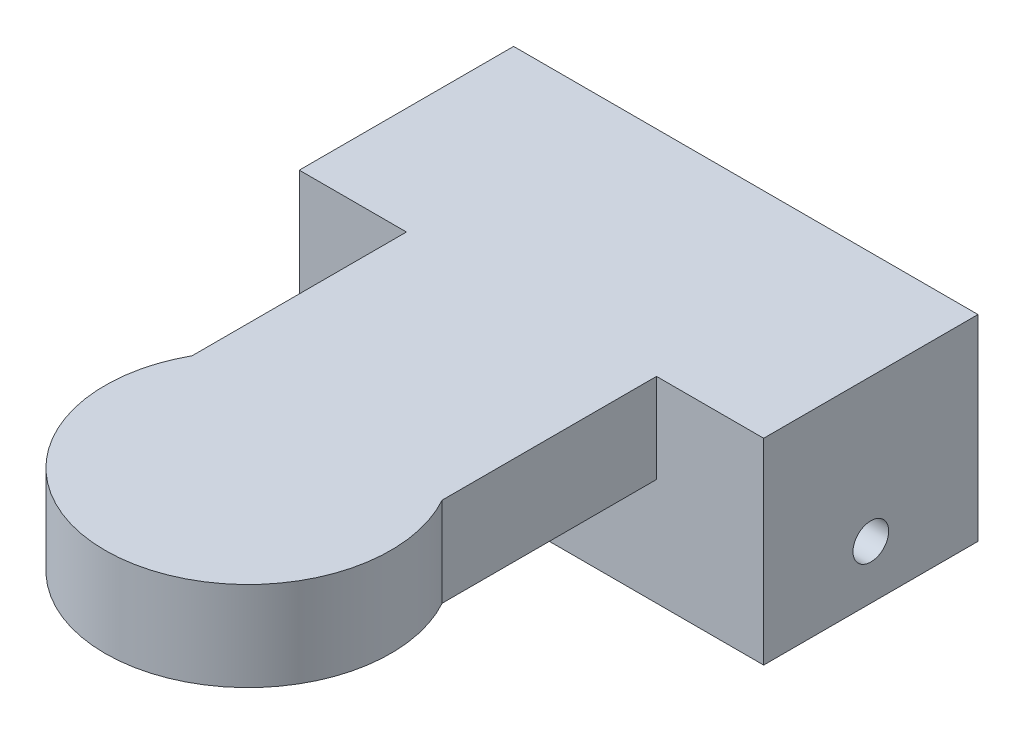
ISO-10303-21;
HEADER;
FILE_DESCRIPTION(('STEP AP214'),'2;1');
FILE_NAME('part.step','',(''),(''),'','','');
FILE_SCHEMA(('AUTOMOTIVE_DESIGN { 1 0 10303 214 1 1 1 1 }'));
ENDSEC;
DATA;
#1=APPLICATION_CONTEXT('core data for automotive mechanical design processes');
#2=APPLICATION_PROTOCOL_DEFINITION('international standard','automotive_design',2000,#1);
#3=PRODUCT_CONTEXT('',#1,'mechanical');
#4=PRODUCT('Part','Part','',(#3));
#5=PRODUCT_RELATED_PRODUCT_CATEGORY('part','',(#4));
#6=PRODUCT_DEFINITION_FORMATION('','',#4);
#7=PRODUCT_DEFINITION_CONTEXT('part definition',#1,'design');
#8=PRODUCT_DEFINITION('design','',#6,#7);
#9=PRODUCT_DEFINITION_SHAPE('','',#8);
#10=(LENGTH_UNIT() NAMED_UNIT(*) SI_UNIT(.MILLI.,.METRE.));
#11=(NAMED_UNIT(*) PLANE_ANGLE_UNIT() SI_UNIT($,.RADIAN.));
#12=(NAMED_UNIT(*) SI_UNIT($,.STERADIAN.) SOLID_ANGLE_UNIT());
#13=UNCERTAINTY_MEASURE_WITH_UNIT(LENGTH_MEASURE(1.E-05),#10,'distance_accuracy_value','');
#14=(GEOMETRIC_REPRESENTATION_CONTEXT(3) GLOBAL_UNCERTAINTY_ASSIGNED_CONTEXT((#13)) GLOBAL_UNIT_ASSIGNED_CONTEXT((#10,
#11,#12)) REPRESENTATION_CONTEXT('',''));
#15=CARTESIAN_POINT('',(0.,0.,0.));
#16=DIRECTION('',(0.,0.,1.));
#17=DIRECTION('',(1.,0.,0.));
#18=AXIS2_PLACEMENT_3D('',#15,#16,#17);
#19=CARTESIAN_POINT('',(0.,0.,0.));
#20=DIRECTION('',(0.,1.,0.));
#21=DIRECTION('',(0.,0.,1.));
#22=AXIS2_PLACEMENT_3D('',#19,#20,#21);
#23=PLANE('',#22);
#24=DIRECTION('',(-1.,0.,0.));
#25=VECTOR('',#24,1.);
#26=CARTESIAN_POINT('',(-22.5,0.,-49.6324583655186));
#27=LINE('',#26,#25);
#28=CARTESIAN_POINT('',(22.5,0.,-49.6324583655186));
#29=VERTEX_POINT('',#28);
#30=CARTESIAN_POINT('',(-22.5,0.,-49.6324583655186));
#31=VERTEX_POINT('',#30);
#32=EDGE_CURVE('E337',#29,#31,#27,.T.);
#33=ORIENTED_EDGE('',*,*,#32,.T.);
#34=DIRECTION('',(0.,0.,1.));
#35=VECTOR('',#34,1.);
#36=CARTESIAN_POINT('',(-22.5,0.,-69.6824583655185));
#37=LINE('',#36,#35);
#38=CARTESIAN_POINT('',(-22.5,0.,-59.7324583655185));
#39=VERTEX_POINT('',#38);
#40=EDGE_CURVE('E203',#39,#31,#37,.T.);
#41=ORIENTED_EDGE('',*,*,#40,.F.);
#42=DIRECTION('',(1.,0.,0.));
#43=VECTOR('',#42,1.);
#44=CARTESIAN_POINT('',(22.5,0.,-59.7324583655185));
#45=LINE('',#44,#43);
#46=CARTESIAN_POINT('',(22.5,0.,-59.7324583655185));
#47=VERTEX_POINT('',#46);
#48=EDGE_CURVE('E325',#39,#47,#45,.T.);
#49=ORIENTED_EDGE('',*,*,#48,.T.);
#50=DIRECTION('',(0.,0.,1.));
#51=VECTOR('',#50,1.);
#52=CARTESIAN_POINT('',(22.5,0.,-69.6824583655185));
#53=LINE('',#52,#51);
#54=EDGE_CURVE('E204',#47,#29,#53,.T.);
#55=ORIENTED_EDGE('',*,*,#54,.T.);
#56=EDGE_LOOP('',(#33,#41,#49,#55));
#57=FACE_BOUND('',#56,.T.);
#58=ADVANCED_FACE('F44',(#57),#23,.F.);
#59=CARTESIAN_POINT('',(22.5,-15.,-69.6824583655185));
#60=DIRECTION('',(1.,0.,0.));
#61=DIRECTION('',(0.,0.,-1.));
#62=AXIS2_PLACEMENT_3D('',#59,#60,#61);
#63=PLANE('',#62);
#64=CARTESIAN_POINT('',(22.5,-7.5,-54.6824583655185));
#65=DIRECTION('',(1.,0.,0.));
#66=DIRECTION('',(0.,0.,-1.));
#67=AXIS2_PLACEMENT_3D('',#64,#65,#66);
#68=CIRCLE('',#67,2.5);
#69=CARTESIAN_POINT('',(22.5,-7.5,-57.1824583655185));
#70=VERTEX_POINT('',#69);
#71=EDGE_CURVE('E286',#70,#70,#68,.T.);
#72=ORIENTED_EDGE('',*,*,#71,.T.);
#73=EDGE_LOOP('',(#72));
#74=FACE_BOUND('',#73,.T.);
#75=DIRECTION('',(0.,1.,0.));
#76=VECTOR('',#75,1.);
#77=CARTESIAN_POINT('',(22.5,0.,-49.6324583655186));
#78=LINE('',#77,#76);
#79=CARTESIAN_POINT('',(22.5,-15.,-49.6324583655186));
#80=VERTEX_POINT('',#79);
#81=EDGE_CURVE('E70',#80,#29,#78,.T.);
#82=ORIENTED_EDGE('',*,*,#81,.T.);
#83=ORIENTED_EDGE('',*,*,#54,.F.);
#84=DIRECTION('',(0.,-1.,0.));
#85=VECTOR('',#84,1.);
#86=CARTESIAN_POINT('',(22.5,0.,-59.7324583655185));
#87=LINE('',#86,#85);
#88=CARTESIAN_POINT('',(22.5,-15.,-59.7324583655185));
#89=VERTEX_POINT('',#88);
#90=EDGE_CURVE('E331',#47,#89,#87,.T.);
#91=ORIENTED_EDGE('',*,*,#90,.T.);
#92=DIRECTION('',(0.,0.,1.));
#93=VECTOR('',#92,1.);
#94=CARTESIAN_POINT('',(22.5,-15.,-69.6824583655185));
#95=LINE('',#94,#93);
#96=EDGE_CURVE('E207',#89,#80,#95,.T.);
#97=ORIENTED_EDGE('',*,*,#96,.T.);
#98=EDGE_LOOP('',(#82,#83,#91,#97));
#99=FACE_BOUND('',#98,.T.);
#100=ADVANCED_FACE('F349',(#74,#99),#63,.F.);
#101=CARTESIAN_POINT('',(-22.5,0.,-69.6824583655185));
#102=DIRECTION('',(-1.,0.,0.));
#103=DIRECTION('',(0.,0.,1.));
#104=AXIS2_PLACEMENT_3D('',#101,#102,#103);
#105=PLANE('',#104);
#106=CARTESIAN_POINT('',(-22.5,-7.49999999999999,-54.6824583655185));
#107=DIRECTION('',(-1.,0.,0.));
#108=DIRECTION('',(0.,0.,1.));
#109=AXIS2_PLACEMENT_3D('',#106,#107,#108);
#110=CIRCLE('',#109,2.5);
#111=CARTESIAN_POINT('',(-22.5,-7.49999999999999,-52.1824583655185));
#112=VERTEX_POINT('',#111);
#113=EDGE_CURVE('E284',#112,#112,#110,.T.);
#114=ORIENTED_EDGE('',*,*,#113,.T.);
#115=EDGE_LOOP('',(#114));
#116=FACE_BOUND('',#115,.T.);
#117=DIRECTION('',(0.,-1.,0.));
#118=VECTOR('',#117,1.);
#119=CARTESIAN_POINT('',(-22.5,0.,-49.6324583655186));
#120=LINE('',#119,#118);
#121=CARTESIAN_POINT('',(-22.5,-15.,-49.6324583655186));
#122=VERTEX_POINT('',#121);
#123=EDGE_CURVE('E336',#31,#122,#120,.T.);
#124=ORIENTED_EDGE('',*,*,#123,.T.);
#125=DIRECTION('',(0.,0.,1.));
#126=VECTOR('',#125,1.);
#127=CARTESIAN_POINT('',(-22.5,-15.,-69.6824583655185));
#128=LINE('',#127,#126);
#129=CARTESIAN_POINT('',(-22.5,-15.,-59.7324583655185));
#130=VERTEX_POINT('',#129);
#131=EDGE_CURVE('E199',#130,#122,#128,.T.);
#132=ORIENTED_EDGE('',*,*,#131,.F.);
#133=DIRECTION('',(0.,1.,0.));
#134=VECTOR('',#133,1.);
#135=CARTESIAN_POINT('',(-22.5,0.,-59.7324583655185));
#136=LINE('',#135,#134);
#137=EDGE_CURVE('E330',#130,#39,#136,.T.);
#138=ORIENTED_EDGE('',*,*,#137,.T.);
#139=ORIENTED_EDGE('',*,*,#40,.T.);
#140=EDGE_LOOP('',(#124,#132,#138,#139));
#141=FACE_BOUND('',#140,.T.);
#142=ADVANCED_FACE('F356',(#116,#141),#105,.F.);
#143=CARTESIAN_POINT('',(0.,0.,0.));
#144=DIRECTION('',(0.,1.,0.));
#145=DIRECTION('',(0.,0.,1.));
#146=AXIS2_PLACEMENT_3D('',#143,#144,#145);
#147=CIRCLE('',#146,12.5);
#148=CARTESIAN_POINT('',(0.,0.,12.5));
#149=VERTEX_POINT('',#148);
#150=EDGE_CURVE('E244',#149,#149,#147,.F.);
#151=ORIENTED_EDGE('',*,*,#150,.F.);
#152=EDGE_LOOP('',(#151));
#153=FACE_BOUND('',#152,.T.);
#154=DIRECTION('',(0.,0.,1.));
#155=VECTOR('',#154,1.);
#156=CARTESIAN_POINT('',(-17.5,0.,-59.6824583655186));
#157=LINE('',#156,#155);
#158=CARTESIAN_POINT('',(-17.5,0.,-39.6824583655185));
#159=VERTEX_POINT('',#158);
#160=CARTESIAN_POINT('',(-17.5,0.,-9.68245836551855));
#161=VERTEX_POINT('',#160);
#162=EDGE_CURVE('E214',#159,#161,#157,.T.);
#163=ORIENTED_EDGE('',*,*,#162,.F.);
#164=DIRECTION('',(-1.,0.,0.));
#165=VECTOR('',#164,1.);
#166=CARTESIAN_POINT('',(-22.5,0.,-39.6824583655185));
#167=LINE('',#166,#165);
#168=CARTESIAN_POINT('',(17.5,0.,-39.6824583655185));
#169=VERTEX_POINT('',#168);
#170=EDGE_CURVE('E254',#169,#159,#167,.T.);
#171=ORIENTED_EDGE('',*,*,#170,.F.);
#172=DIRECTION('',(0.,0.,-1.));
#173=VECTOR('',#172,1.);
#174=CARTESIAN_POINT('',(17.5,0.,-59.6824583655186));
#175=LINE('',#174,#173);
#176=CARTESIAN_POINT('',(17.5,0.,-9.68245836551855));
#177=VERTEX_POINT('',#176);
#178=EDGE_CURVE('E212',#177,#169,#175,.T.);
#179=ORIENTED_EDGE('',*,*,#178,.F.);
#180=CARTESIAN_POINT('',(0.,0.,0.));
#181=DIRECTION('',(0.,1.,0.));
#182=DIRECTION('',(0.,0.,1.));
#183=AXIS2_PLACEMENT_3D('',#180,#181,#182);
#184=CIRCLE('',#183,20.);
#185=EDGE_CURVE('E240',#161,#177,#184,.T.);
#186=ORIENTED_EDGE('',*,*,#185,.F.);
#187=EDGE_LOOP('',(#163,#171,#179,#186));
#188=FACE_BOUND('',#187,.T.);
#189=ADVANCED_FACE('F363',(#153,#188),#23,.F.);
#190=CARTESIAN_POINT('',(0.,-6.,0.));
#191=DIRECTION('',(0.,1.,0.));
#192=DIRECTION('',(0.,0.,1.));
#193=AXIS2_PLACEMENT_3D('',#190,#191,#192);
#194=CYLINDRICAL_SURFACE('',#193,12.5);
#195=ORIENTED_EDGE('',*,*,#150,.T.);
#196=EDGE_LOOP('',(#195));
#197=FACE_BOUND('',#196,.T.);
#198=CARTESIAN_POINT('',(0.,-3.5,0.));
#199=DIRECTION('',(0.,-1.,0.));
#200=DIRECTION('',(0.,0.,-1.));
#201=AXIS2_PLACEMENT_3D('',#198,#199,#200);
#202=CIRCLE('',#201,12.5);
#203=CARTESIAN_POINT('',(0.,-3.5,-12.5));
#204=VERTEX_POINT('',#203);
#205=EDGE_CURVE('E323',#204,#204,#202,.T.);
#206=ORIENTED_EDGE('',*,*,#205,.F.);
#207=EDGE_LOOP('',(#206));
#208=FACE_BOUND('',#207,.T.);
#209=ADVANCED_FACE('F368',(#197,#208),#194,.T.);
#210=CARTESIAN_POINT('',(-17.5,71.0327780786685,-59.6824583655186));
#211=DIRECTION('',(1.,0.,0.));
#212=DIRECTION('',(0.,0.,-1.));
#213=AXIS2_PLACEMENT_3D('',#210,#211,#212);
#214=PLANE('',#213);
#215=DIRECTION('',(0.,1.,0.));
#216=VECTOR('',#215,1.);
#217=CARTESIAN_POINT('',(-17.5,71.0327780786685,-39.6824583655185));
#218=LINE('',#217,#216);
#219=CARTESIAN_POINT('',(-17.5,12.5,-39.6824583655185));
#220=VERTEX_POINT('',#219);
#221=EDGE_CURVE('E208',#159,#220,#218,.T.);
#222=ORIENTED_EDGE('',*,*,#221,.F.);
#223=ORIENTED_EDGE('',*,*,#162,.T.);
#224=DIRECTION('',(0.,-1.,0.));
#225=VECTOR('',#224,1.);
#226=CARTESIAN_POINT('',(-17.5,71.0327780786685,-9.68245836551855));
#227=LINE('',#226,#225);
#228=CARTESIAN_POINT('',(-17.5,12.5,-9.68245836551855));
#229=VERTEX_POINT('',#228);
#230=EDGE_CURVE('E216',#229,#161,#227,.T.);
#231=ORIENTED_EDGE('',*,*,#230,.F.);
#232=DIRECTION('',(0.,0.,1.));
#233=VECTOR('',#232,1.);
#234=CARTESIAN_POINT('',(-17.5,12.5,-39.6824583655185));
#235=LINE('',#234,#233);
#236=EDGE_CURVE('E274',#220,#229,#235,.T.);
#237=ORIENTED_EDGE('',*,*,#236,.F.);
#238=EDGE_LOOP('',(#222,#223,#231,#237));
#239=FACE_BOUND('',#238,.T.);
#240=ADVANCED_FACE('F391',(#239),#214,.F.);
#241=CARTESIAN_POINT('',(17.5,71.0327780786685,-59.6824583655186));
#242=DIRECTION('',(-1.,0.,0.));
#243=DIRECTION('',(0.,0.,1.));
#244=AXIS2_PLACEMENT_3D('',#241,#242,#243);
#245=PLANE('',#244);
#246=DIRECTION('',(0.,-1.,0.));
#247=VECTOR('',#246,1.);
#248=CARTESIAN_POINT('',(17.5,71.0327780786685,-39.6824583655185));
#249=LINE('',#248,#247);
#250=CARTESIAN_POINT('',(17.5,12.5,-39.6824583655185));
#251=VERTEX_POINT('',#250);
#252=EDGE_CURVE('E52',#251,#169,#249,.T.);
#253=ORIENTED_EDGE('',*,*,#252,.F.);
#254=DIRECTION('',(0.,0.,-1.));
#255=VECTOR('',#254,1.);
#256=CARTESIAN_POINT('',(17.5,12.5,-39.6824583655185));
#257=LINE('',#256,#255);
#258=CARTESIAN_POINT('',(17.5,12.5,-9.68245836551855));
#259=VERTEX_POINT('',#258);
#260=EDGE_CURVE('E256',#259,#251,#257,.T.);
#261=ORIENTED_EDGE('',*,*,#260,.F.);
#262=DIRECTION('',(0.,-1.,0.));
#263=VECTOR('',#262,1.);
#264=CARTESIAN_POINT('',(17.5,71.0327780786685,-9.68245836551855));
#265=LINE('',#264,#263);
#266=EDGE_CURVE('E220',#259,#177,#265,.T.);
#267=ORIENTED_EDGE('',*,*,#266,.T.);
#268=ORIENTED_EDGE('',*,*,#178,.T.);
#269=EDGE_LOOP('',(#253,#261,#267,#268));
#270=FACE_BOUND('',#269,.T.);
#271=ADVANCED_FACE('F260',(#270),#245,.F.);
#272=CARTESIAN_POINT('',(0.,10.,0.));
#273=DIRECTION('',(0.,-1.,0.));
#274=DIRECTION('',(0.,0.,-1.));
#275=AXIS2_PLACEMENT_3D('',#272,#273,#274);
#276=CYLINDRICAL_SURFACE('',#275,20.);
#277=ORIENTED_EDGE('',*,*,#230,.T.);
#278=ORIENTED_EDGE('',*,*,#185,.T.);
#279=ORIENTED_EDGE('',*,*,#266,.F.);
#280=CARTESIAN_POINT('',(0.,12.5,0.));
#281=DIRECTION('',(0.,1.,0.));
#282=DIRECTION('',(0.,0.,1.));
#283=AXIS2_PLACEMENT_3D('',#280,#281,#282);
#284=CIRCLE('',#283,20.);
#285=EDGE_CURVE('E267',#229,#259,#284,.T.);
#286=ORIENTED_EDGE('',*,*,#285,.F.);
#287=EDGE_LOOP('',(#277,#278,#279,#286));
#288=FACE_BOUND('',#287,.T.);
#289=ADVANCED_FACE('F50',(#288),#276,.T.);
#290=CARTESIAN_POINT('',(0.,0.,-39.6824583655185));
#291=DIRECTION('',(0.,0.,-1.));
#292=DIRECTION('',(-1.,0.,0.));
#293=AXIS2_PLACEMENT_3D('',#290,#291,#292);
#294=PLANE('',#293);
#295=DIRECTION('',(0.,1.,0.));
#296=VECTOR('',#295,1.);
#297=CARTESIAN_POINT('',(-32.5,-15.,-39.6824583655185));
#298=LINE('',#297,#296);
#299=CARTESIAN_POINT('',(-32.5,-15.,-39.6824583655185));
#300=VERTEX_POINT('',#299);
#301=CARTESIAN_POINT('',(-32.5,12.5,-39.6824583655185));
#302=VERTEX_POINT('',#301);
#303=EDGE_CURVE('E194',#300,#302,#298,.T.);
#304=ORIENTED_EDGE('',*,*,#303,.F.);
#305=DIRECTION('',(-1.,0.,0.));
#306=VECTOR('',#305,1.);
#307=CARTESIAN_POINT('',(32.5,-15.,-39.6824583655185));
#308=LINE('',#307,#306);
#309=CARTESIAN_POINT('',(32.5,-15.,-39.6824583655185));
#310=VERTEX_POINT('',#309);
#311=EDGE_CURVE('E295',#310,#300,#308,.T.);
#312=ORIENTED_EDGE('',*,*,#311,.F.);
#313=DIRECTION('',(0.,-1.,0.));
#314=VECTOR('',#313,1.);
#315=CARTESIAN_POINT('',(32.5,10.,-39.6824583655185));
#316=LINE('',#315,#314);
#317=CARTESIAN_POINT('',(32.5,12.5,-39.6824583655185));
#318=VERTEX_POINT('',#317);
#319=EDGE_CURVE('E293',#318,#310,#316,.T.);
#320=ORIENTED_EDGE('',*,*,#319,.F.);
#321=DIRECTION('',(1.,0.,0.));
#322=VECTOR('',#321,1.);
#323=CARTESIAN_POINT('',(17.5,12.5,-39.6824583655185));
#324=LINE('',#323,#322);
#325=EDGE_CURVE('E253',#251,#318,#324,.T.);
#326=ORIENTED_EDGE('',*,*,#325,.F.);
#327=ORIENTED_EDGE('',*,*,#252,.T.);
#328=ORIENTED_EDGE('',*,*,#170,.T.);
#329=ORIENTED_EDGE('',*,*,#221,.T.);
#330=DIRECTION('',(1.,0.,0.));
#331=VECTOR('',#330,1.);
#332=CARTESIAN_POINT('',(-32.5,12.5,-39.6824583655185));
#333=LINE('',#332,#331);
#334=EDGE_CURVE('E303',#302,#220,#333,.T.);
#335=ORIENTED_EDGE('',*,*,#334,.F.);
#336=EDGE_LOOP('',(#304,#312,#320,#326,#327,#328,#329,#335));
#337=FACE_BOUND('',#336,.T.);
#338=ADVANCED_FACE('F255',(#337),#294,.F.);
#339=CARTESIAN_POINT('',(32.5,10.,-69.6824583655185));
#340=DIRECTION('',(-1.,0.,0.));
#341=DIRECTION('',(0.,0.,1.));
#342=AXIS2_PLACEMENT_3D('',#339,#340,#341);
#343=PLANE('',#342);
#344=CARTESIAN_POINT('',(32.5,-7.5,-54.6824583655185));
#345=DIRECTION('',(1.,0.,0.));
#346=DIRECTION('',(0.,1.,0.));
#347=AXIS2_PLACEMENT_3D('',#344,#345,#346);
#348=CIRCLE('',#347,2.5);
#349=CARTESIAN_POINT('',(32.5,-4.99999999999999,-54.6824583655185));
#350=VERTEX_POINT('',#349);
#351=EDGE_CURVE('E280',#350,#350,#348,.T.);
#352=ORIENTED_EDGE('',*,*,#351,.F.);
#353=EDGE_LOOP('',(#352));
#354=FACE_BOUND('',#353,.T.);
#355=DIRECTION('',(0.,-1.,0.));
#356=VECTOR('',#355,1.);
#357=CARTESIAN_POINT('',(32.5,10.,-69.6824583655185));
#358=LINE('',#357,#356);
#359=CARTESIAN_POINT('',(32.5,12.5,-69.6824583655185));
#360=VERTEX_POINT('',#359);
#361=CARTESIAN_POINT('',(32.5,-15.,-69.6824583655185));
#362=VERTEX_POINT('',#361);
#363=EDGE_CURVE('E186',#360,#362,#358,.T.);
#364=ORIENTED_EDGE('',*,*,#363,.F.);
#365=DIRECTION('',(0.,0.,-1.));
#366=VECTOR('',#365,1.);
#367=CARTESIAN_POINT('',(32.5,12.5,-69.6824583655185));
#368=LINE('',#367,#366);
#369=EDGE_CURVE('E275',#318,#360,#368,.T.);
#370=ORIENTED_EDGE('',*,*,#369,.F.);
#371=ORIENTED_EDGE('',*,*,#319,.T.);
#372=DIRECTION('',(0.,0.,1.));
#373=VECTOR('',#372,1.);
#374=CARTESIAN_POINT('',(32.5,-15.,-69.6824583655185));
#375=LINE('',#374,#373);
#376=EDGE_CURVE('E206',#362,#310,#375,.T.);
#377=ORIENTED_EDGE('',*,*,#376,.F.);
#378=EDGE_LOOP('',(#364,#370,#371,#377));
#379=FACE_BOUND('',#378,.T.);
#380=ADVANCED_FACE('F401',(#354,#379),#343,.F.);
#381=CARTESIAN_POINT('',(32.5,-15.,-69.6824583655185));
#382=DIRECTION('',(0.,1.,0.));
#383=DIRECTION('',(0.,0.,1.));
#384=AXIS2_PLACEMENT_3D('',#381,#382,#383);
#385=PLANE('',#384);
#386=DIRECTION('',(-1.,0.,0.));
#387=VECTOR('',#386,1.);
#388=CARTESIAN_POINT('',(22.5,-15.,-59.7324583655185));
#389=LINE('',#388,#387);
#390=CARTESIAN_POINT('',(15.2069063257456,-15.,-59.7324583655185));
#391=VERTEX_POINT('',#390);
#392=EDGE_CURVE('E328',#89,#391,#389,.T.);
#393=ORIENTED_EDGE('',*,*,#392,.T.);
#394=DIRECTION('',(0.,0.,-1.));
#395=VECTOR('',#394,1.);
#396=CARTESIAN_POINT('',(15.2069063257456,-15.,-59.6824583655185));
#397=LINE('',#396,#395);
#398=CARTESIAN_POINT('',(15.2069063257456,-15.,-69.6824583655185));
#399=VERTEX_POINT('',#398);
#400=EDGE_CURVE('E58',#391,#399,#397,.T.);
#401=ORIENTED_EDGE('',*,*,#400,.T.);
#402=DIRECTION('',(-1.,0.,0.));
#403=VECTOR('',#402,1.);
#404=CARTESIAN_POINT('',(32.5,-15.,-69.6824583655185));
#405=LINE('',#404,#403);
#406=EDGE_CURVE('E185',#362,#399,#405,.T.);
#407=ORIENTED_EDGE('',*,*,#406,.F.);
#408=ORIENTED_EDGE('',*,*,#376,.T.);
#409=ORIENTED_EDGE('',*,*,#311,.T.);
#410=DIRECTION('',(0.,0.,1.));
#411=VECTOR('',#410,1.);
#412=CARTESIAN_POINT('',(-32.5,-15.,-69.6824583655185));
#413=LINE('',#412,#411);
#414=CARTESIAN_POINT('',(-32.5,-15.,-69.6824583655185));
#415=VERTEX_POINT('',#414);
#416=EDGE_CURVE('E190',#415,#300,#413,.T.);
#417=ORIENTED_EDGE('',*,*,#416,.F.);
#418=CARTESIAN_POINT('',(-15.2069063257456,-15.,-69.6824583655185));
#419=VERTEX_POINT('',#418);
#420=EDGE_CURVE('E177',#419,#415,#405,.T.);
#421=ORIENTED_EDGE('',*,*,#420,.F.);
#422=DIRECTION('',(0.,0.,-1.));
#423=VECTOR('',#422,1.);
#424=CARTESIAN_POINT('',(-15.2069063257456,-15.,-59.6824583655185));
#425=LINE('',#424,#423);
#426=CARTESIAN_POINT('',(-15.2069063257456,-15.,-59.7324583655185));
#427=VERTEX_POINT('',#426);
#428=EDGE_CURVE('E166',#419,#427,#425,.F.);
#429=ORIENTED_EDGE('',*,*,#428,.T.);
#430=EDGE_CURVE('E335',#427,#130,#389,.T.);
#431=ORIENTED_EDGE('',*,*,#430,.T.);
#432=ORIENTED_EDGE('',*,*,#131,.T.);
#433=DIRECTION('',(1.,0.,0.));
#434=VECTOR('',#433,1.);
#435=CARTESIAN_POINT('',(-22.5,-15.,-49.6324583655186));
#436=LINE('',#435,#434);
#437=EDGE_CURVE('E343',#122,#80,#436,.T.);
#438=ORIENTED_EDGE('',*,*,#437,.T.);
#439=ORIENTED_EDGE('',*,*,#96,.F.);
#440=EDGE_LOOP('',(#393,#401,#407,#408,#409,#417,#421,#429,#431,#432,#438,#439));
#441=FACE_BOUND('',#440,.T.);
#442=ADVANCED_FACE('F184',(#441),#385,.F.);
#443=CARTESIAN_POINT('',(-32.5,-15.,-69.6824583655185));
#444=DIRECTION('',(1.,0.,0.));
#445=DIRECTION('',(0.,0.,-1.));
#446=AXIS2_PLACEMENT_3D('',#443,#444,#445);
#447=PLANE('',#446);
#448=CARTESIAN_POINT('',(-32.5,-7.49999999999999,-54.6824583655185));
#449=DIRECTION('',(1.,0.,0.));
#450=DIRECTION('',(0.,1.,0.));
#451=AXIS2_PLACEMENT_3D('',#448,#449,#450);
#452=CIRCLE('',#451,2.5);
#453=CARTESIAN_POINT('',(-32.5,-4.99999999999999,-54.6824583655185));
#454=VERTEX_POINT('',#453);
#455=EDGE_CURVE('E276',#454,#454,#452,.T.);
#456=ORIENTED_EDGE('',*,*,#455,.T.);
#457=EDGE_LOOP('',(#456));
#458=FACE_BOUND('',#457,.T.);
#459=ORIENTED_EDGE('',*,*,#416,.T.);
#460=ORIENTED_EDGE('',*,*,#303,.T.);
#461=DIRECTION('',(0.,0.,1.));
#462=VECTOR('',#461,1.);
#463=CARTESIAN_POINT('',(-32.5,12.5,-69.6824583655185));
#464=LINE('',#463,#462);
#465=CARTESIAN_POINT('',(-32.5,12.5,-69.6824583655185));
#466=VERTEX_POINT('',#465);
#467=EDGE_CURVE('E299',#466,#302,#464,.T.);
#468=ORIENTED_EDGE('',*,*,#467,.F.);
#469=DIRECTION('',(0.,1.,0.));
#470=VECTOR('',#469,1.);
#471=CARTESIAN_POINT('',(-32.5,-15.,-69.6824583655185));
#472=LINE('',#471,#470);
#473=EDGE_CURVE('E193',#415,#466,#472,.T.);
#474=ORIENTED_EDGE('',*,*,#473,.F.);
#475=EDGE_LOOP('',(#459,#460,#468,#474));
#476=FACE_BOUND('',#475,.T.);
#477=ADVANCED_FACE('F296',(#458,#476),#447,.F.);
#478=CARTESIAN_POINT('',(0.,0.,-69.6824583655185));
#479=DIRECTION('',(0.,0.,-1.));
#480=DIRECTION('',(-1.,0.,0.));
#481=AXIS2_PLACEMENT_3D('',#478,#479,#480);
#482=PLANE('',#481);
#483=CARTESIAN_POINT('',(0.,-60.,-69.6824583655185));
#484=DIRECTION('',(0.,0.,-1.));
#485=DIRECTION('',(-1.,0.,0.));
#486=AXIS2_PLACEMENT_3D('',#483,#484,#485);
#487=CIRCLE('',#486,47.5);
#488=EDGE_CURVE('E171',#419,#399,#487,.T.);
#489=ORIENTED_EDGE('',*,*,#488,.F.);
#490=ORIENTED_EDGE('',*,*,#420,.T.);
#491=ORIENTED_EDGE('',*,*,#473,.T.);
#492=DIRECTION('',(-1.,0.,0.));
#493=VECTOR('',#492,1.);
#494=CARTESIAN_POINT('',(32.5,12.5,-69.6824583655185));
#495=LINE('',#494,#493);
#496=EDGE_CURVE('E306',#360,#466,#495,.T.);
#497=ORIENTED_EDGE('',*,*,#496,.F.);
#498=ORIENTED_EDGE('',*,*,#363,.T.);
#499=ORIENTED_EDGE('',*,*,#406,.T.);
#500=EDGE_LOOP('',(#489,#490,#491,#497,#498,#499));
#501=FACE_BOUND('',#500,.T.);
#502=ADVANCED_FACE('F178',(#501),#482,.T.);
#503=CARTESIAN_POINT('',(-32.5,-7.49999999999999,-54.6824583655185));
#504=DIRECTION('',(1.,0.,0.));
#505=DIRECTION('',(0.,1.,0.));
#506=AXIS2_PLACEMENT_3D('',#503,#504,#505);
#507=CYLINDRICAL_SURFACE('',#506,2.5);
#508=ORIENTED_EDGE('',*,*,#455,.F.);
#509=EDGE_LOOP('',(#508));
#510=FACE_BOUND('',#509,.T.);
#511=ORIENTED_EDGE('',*,*,#113,.F.);
#512=EDGE_LOOP('',(#511));
#513=FACE_BOUND('',#512,.T.);
#514=ADVANCED_FACE('F420',(#510,#513),#507,.F.);
#515=ORIENTED_EDGE('',*,*,#351,.T.);
#516=EDGE_LOOP('',(#515));
#517=FACE_BOUND('',#516,.T.);
#518=ORIENTED_EDGE('',*,*,#71,.F.);
#519=EDGE_LOOP('',(#518));
#520=FACE_BOUND('',#519,.T.);
#521=ADVANCED_FACE('F422',(#517,#520),#507,.F.);
#522=CARTESIAN_POINT('',(0.,12.5,0.));
#523=DIRECTION('',(0.,1.,0.));
#524=DIRECTION('',(0.,0.,1.));
#525=AXIS2_PLACEMENT_3D('',#522,#523,#524);
#526=PLANE('',#525);
#527=ORIENTED_EDGE('',*,*,#496,.T.);
#528=ORIENTED_EDGE('',*,*,#467,.T.);
#529=ORIENTED_EDGE('',*,*,#334,.T.);
#530=ORIENTED_EDGE('',*,*,#236,.T.);
#531=ORIENTED_EDGE('',*,*,#285,.T.);
#532=ORIENTED_EDGE('',*,*,#260,.T.);
#533=ORIENTED_EDGE('',*,*,#325,.T.);
#534=ORIENTED_EDGE('',*,*,#369,.T.);
#535=EDGE_LOOP('',(#527,#528,#529,#530,#531,#532,#533,#534));
#536=FACE_BOUND('',#535,.T.);
#537=ADVANCED_FACE('F263',(#536),#526,.T.);
#538=CARTESIAN_POINT('',(0.,-3.5,0.));
#539=DIRECTION('',(0.,-1.,0.));
#540=DIRECTION('',(0.,0.,-1.));
#541=AXIS2_PLACEMENT_3D('',#538,#539,#540);
#542=PLANE('',#541);
#543=CARTESIAN_POINT('',(0.,-3.5,0.));
#544=DIRECTION('',(0.,-1.,0.));
#545=DIRECTION('',(0.,0.,-1.));
#546=AXIS2_PLACEMENT_3D('',#543,#544,#545);
#547=CIRCLE('',#546,4.1);
#548=CARTESIAN_POINT('',(3.6,-3.5,-1.96214168703486));
#549=VERTEX_POINT('',#548);
#550=CARTESIAN_POINT('',(1.96214168703486,-3.5,-3.6));
#551=VERTEX_POINT('',#550);
#552=EDGE_CURVE('E316',#549,#551,#547,.F.);
#553=ORIENTED_EDGE('',*,*,#552,.T.);
#554=DIRECTION('',(1.,0.,0.));
#555=VECTOR('',#554,1.);
#556=CARTESIAN_POINT('',(0.,-3.5,-3.6));
#557=LINE('',#556,#555);
#558=CARTESIAN_POINT('',(-1.96214168703486,-3.5,-3.6));
#559=VERTEX_POINT('',#558);
#560=EDGE_CURVE('E317',#559,#551,#557,.T.);
#561=ORIENTED_EDGE('',*,*,#560,.F.);
#562=CARTESIAN_POINT('',(0.,-3.5,0.));
#563=DIRECTION('',(0.,-1.,0.));
#564=DIRECTION('',(0.,0.,-1.));
#565=AXIS2_PLACEMENT_3D('',#562,#563,#564);
#566=CIRCLE('',#565,4.1);
#567=CARTESIAN_POINT('',(3.6,-3.5,1.96214168703486));
#568=VERTEX_POINT('',#567);
#569=EDGE_CURVE('E313',#559,#568,#566,.F.);
#570=ORIENTED_EDGE('',*,*,#569,.T.);
#571=DIRECTION('',(0.,0.,1.));
#572=VECTOR('',#571,1.);
#573=CARTESIAN_POINT('',(3.6,-3.5,0.));
#574=LINE('',#573,#572);
#575=EDGE_CURVE('E311',#549,#568,#574,.T.);
#576=ORIENTED_EDGE('',*,*,#575,.F.);
#577=EDGE_LOOP('',(#553,#561,#570,#576));
#578=FACE_BOUND('',#577,.T.);
#579=ORIENTED_EDGE('',*,*,#205,.T.);
#580=EDGE_LOOP('',(#579));
#581=FACE_BOUND('',#580,.T.);
#582=ADVANCED_FACE('F430',(#578,#581),#542,.T.);
#583=CARTESIAN_POINT('',(0.,10.,0.));
#584=DIRECTION('',(0.,1.,0.));
#585=DIRECTION('',(0.,0.,1.));
#586=AXIS2_PLACEMENT_3D('',#583,#584,#585);
#587=PLANE('',#586);
#588=CARTESIAN_POINT('',(0.,10.,0.));
#589=DIRECTION('',(0.,1.,0.));
#590=DIRECTION('',(0.,0.,1.));
#591=AXIS2_PLACEMENT_3D('',#588,#589,#590);
#592=CIRCLE('',#591,4.1);
#593=CARTESIAN_POINT('',(3.6,10.,-1.96214168703486));
#594=VERTEX_POINT('',#593);
#595=CARTESIAN_POINT('',(1.96214168703486,10.,-3.6));
#596=VERTEX_POINT('',#595);
#597=EDGE_CURVE('E222',#594,#596,#592,.T.);
#598=ORIENTED_EDGE('',*,*,#597,.F.);
#599=DIRECTION('',(0.,0.,1.));
#600=VECTOR('',#599,1.);
#601=CARTESIAN_POINT('',(3.6,10.,0.));
#602=LINE('',#601,#600);
#603=CARTESIAN_POINT('',(3.6,10.,1.96214168703486));
#604=VERTEX_POINT('',#603);
#605=EDGE_CURVE('E217',#594,#604,#602,.T.);
#606=ORIENTED_EDGE('',*,*,#605,.T.);
#607=CARTESIAN_POINT('',(0.,10.,0.));
#608=DIRECTION('',(0.,1.,0.));
#609=DIRECTION('',(0.,0.,1.));
#610=AXIS2_PLACEMENT_3D('',#607,#608,#609);
#611=CIRCLE('',#610,4.1);
#612=CARTESIAN_POINT('',(-1.96214168703486,10.,-3.6));
#613=VERTEX_POINT('',#612);
#614=EDGE_CURVE('E233',#613,#604,#611,.T.);
#615=ORIENTED_EDGE('',*,*,#614,.F.);
#616=DIRECTION('',(1.,0.,0.));
#617=VECTOR('',#616,1.);
#618=CARTESIAN_POINT('',(0.,10.,-3.6));
#619=LINE('',#618,#617);
#620=EDGE_CURVE('E226',#613,#596,#619,.T.);
#621=ORIENTED_EDGE('',*,*,#620,.T.);
#622=EDGE_LOOP('',(#598,#606,#615,#621));
#623=FACE_BOUND('',#622,.T.);
#624=ADVANCED_FACE('F388',(#623),#587,.F.);
#625=CARTESIAN_POINT('',(0.,0.,0.));
#626=DIRECTION('',(0.,1.,0.));
#627=DIRECTION('',(0.,0.,1.));
#628=AXIS2_PLACEMENT_3D('',#625,#626,#627);
#629=CYLINDRICAL_SURFACE('',#628,4.1);
#630=ORIENTED_EDGE('',*,*,#552,.F.);
#631=DIRECTION('',(0.,1.,0.));
#632=VECTOR('',#631,1.);
#633=CARTESIAN_POINT('',(3.6,0.,-1.96214168703486));
#634=LINE('',#633,#632);
#635=EDGE_CURVE('E234',#549,#594,#634,.T.);
#636=ORIENTED_EDGE('',*,*,#635,.T.);
#637=ORIENTED_EDGE('',*,*,#597,.T.);
#638=DIRECTION('',(0.,1.,0.));
#639=VECTOR('',#638,1.);
#640=CARTESIAN_POINT('',(1.96214168703486,0.,-3.6));
#641=LINE('',#640,#639);
#642=EDGE_CURVE('E239',#551,#596,#641,.T.);
#643=ORIENTED_EDGE('',*,*,#642,.F.);
#644=EDGE_LOOP('',(#630,#636,#637,#643));
#645=FACE_BOUND('',#644,.T.);
#646=ADVANCED_FACE('F385',(#645),#629,.F.);
#647=CARTESIAN_POINT('',(0.,0.,-3.6));
#648=DIRECTION('',(0.,0.,1.));
#649=DIRECTION('',(1.,0.,0.));
#650=AXIS2_PLACEMENT_3D('',#647,#648,#649);
#651=PLANE('',#650);
#652=DIRECTION('',(0.,1.,0.));
#653=VECTOR('',#652,1.);
#654=CARTESIAN_POINT('',(-1.96214168703486,0.,-3.6));
#655=LINE('',#654,#653);
#656=EDGE_CURVE('E238',#559,#613,#655,.T.);
#657=ORIENTED_EDGE('',*,*,#656,.F.);
#658=ORIENTED_EDGE('',*,*,#560,.T.);
#659=ORIENTED_EDGE('',*,*,#642,.T.);
#660=ORIENTED_EDGE('',*,*,#620,.F.);
#661=EDGE_LOOP('',(#657,#658,#659,#660));
#662=FACE_BOUND('',#661,.T.);
#663=ADVANCED_FACE('F383',(#662),#651,.T.);
#664=CARTESIAN_POINT('',(0.,0.,0.));
#665=DIRECTION('',(0.,1.,0.));
#666=DIRECTION('',(0.,0.,1.));
#667=AXIS2_PLACEMENT_3D('',#664,#665,#666);
#668=CYLINDRICAL_SURFACE('',#667,4.1);
#669=ORIENTED_EDGE('',*,*,#569,.F.);
#670=ORIENTED_EDGE('',*,*,#656,.T.);
#671=ORIENTED_EDGE('',*,*,#614,.T.);
#672=DIRECTION('',(0.,1.,0.));
#673=VECTOR('',#672,1.);
#674=CARTESIAN_POINT('',(3.6,0.,1.96214168703486));
#675=LINE('',#674,#673);
#676=EDGE_CURVE('E232',#568,#604,#675,.T.);
#677=ORIENTED_EDGE('',*,*,#676,.F.);
#678=EDGE_LOOP('',(#669,#670,#671,#677));
#679=FACE_BOUND('',#678,.T.);
#680=ADVANCED_FACE('F379',(#679),#668,.F.);
#681=CARTESIAN_POINT('',(3.6,0.,0.));
#682=DIRECTION('',(-1.,0.,0.));
#683=DIRECTION('',(0.,0.,1.));
#684=AXIS2_PLACEMENT_3D('',#681,#682,#683);
#685=PLANE('',#684);
#686=ORIENTED_EDGE('',*,*,#635,.F.);
#687=ORIENTED_EDGE('',*,*,#575,.T.);
#688=ORIENTED_EDGE('',*,*,#676,.T.);
#689=ORIENTED_EDGE('',*,*,#605,.F.);
#690=EDGE_LOOP('',(#686,#687,#688,#689));
#691=FACE_BOUND('',#690,.T.);
#692=ADVANCED_FACE('F377',(#691),#685,.T.);
#693=CARTESIAN_POINT('',(0.,0.,-59.7324583655185));
#694=DIRECTION('',(0.,0.,-1.));
#695=DIRECTION('',(-1.,0.,0.));
#696=AXIS2_PLACEMENT_3D('',#693,#694,#695);
#697=PLANE('',#696);
#698=ORIENTED_EDGE('',*,*,#430,.F.);
#699=CARTESIAN_POINT('',(0.,-60.,-59.7324583655185));
#700=DIRECTION('',(0.,0.,-1.));
#701=DIRECTION('',(-1.,0.,0.));
#702=AXIS2_PLACEMENT_3D('',#699,#700,#701);
#703=CIRCLE('',#702,47.5);
#704=EDGE_CURVE('E11',#427,#391,#703,.T.);
#705=ORIENTED_EDGE('',*,*,#704,.T.);
#706=ORIENTED_EDGE('',*,*,#392,.F.);
#707=ORIENTED_EDGE('',*,*,#90,.F.);
#708=ORIENTED_EDGE('',*,*,#48,.F.);
#709=ORIENTED_EDGE('',*,*,#137,.F.);
#710=EDGE_LOOP('',(#698,#705,#706,#707,#708,#709));
#711=FACE_BOUND('',#710,.T.);
#712=ADVANCED_FACE('F350',(#711),#697,.F.);
#713=CARTESIAN_POINT('',(0.,0.,-49.6324583655186));
#714=DIRECTION('',(0.,0.,1.));
#715=DIRECTION('',(1.,0.,0.));
#716=AXIS2_PLACEMENT_3D('',#713,#714,#715);
#717=PLANE('',#716);
#718=ORIENTED_EDGE('',*,*,#123,.F.);
#719=ORIENTED_EDGE('',*,*,#32,.F.);
#720=ORIENTED_EDGE('',*,*,#81,.F.);
#721=ORIENTED_EDGE('',*,*,#437,.F.);
#722=EDGE_LOOP('',(#718,#719,#720,#721));
#723=FACE_BOUND('',#722,.T.);
#724=ADVANCED_FACE('F354',(#723),#717,.F.);
#725=CARTESIAN_POINT('',(0.,-60.,-59.6824583655185));
#726=DIRECTION('',(0.,0.,-1.));
#727=DIRECTION('',(-1.,0.,0.));
#728=AXIS2_PLACEMENT_3D('',#725,#726,#727);
#729=CYLINDRICAL_SURFACE('',#728,47.5);
#730=ORIENTED_EDGE('',*,*,#704,.F.);
#731=ORIENTED_EDGE('',*,*,#428,.F.);
#732=ORIENTED_EDGE('',*,*,#488,.T.);
#733=ORIENTED_EDGE('',*,*,#400,.F.);
#734=EDGE_LOOP('',(#730,#731,#732,#733));
#735=FACE_BOUND('',#734,.T.);
#736=ADVANCED_FACE('F167',(#735),#729,.F.);
#737=CLOSED_SHELL('',(#58,#100,#142,#189,#209,#240,#271,#289,#338,#380,#442,#477,#502,#514,#521,
#537,#582,#624,#646,#663,#680,#692,#712,#724,#736));
#738=MANIFOLD_SOLID_BREP('B2',#737);
#739=ADVANCED_BREP_SHAPE_REPRESENTATION('',(#18,#738),#14);
#740=SHAPE_DEFINITION_REPRESENTATION(#9,#739);
ENDSEC;
END-ISO-10303-21;
